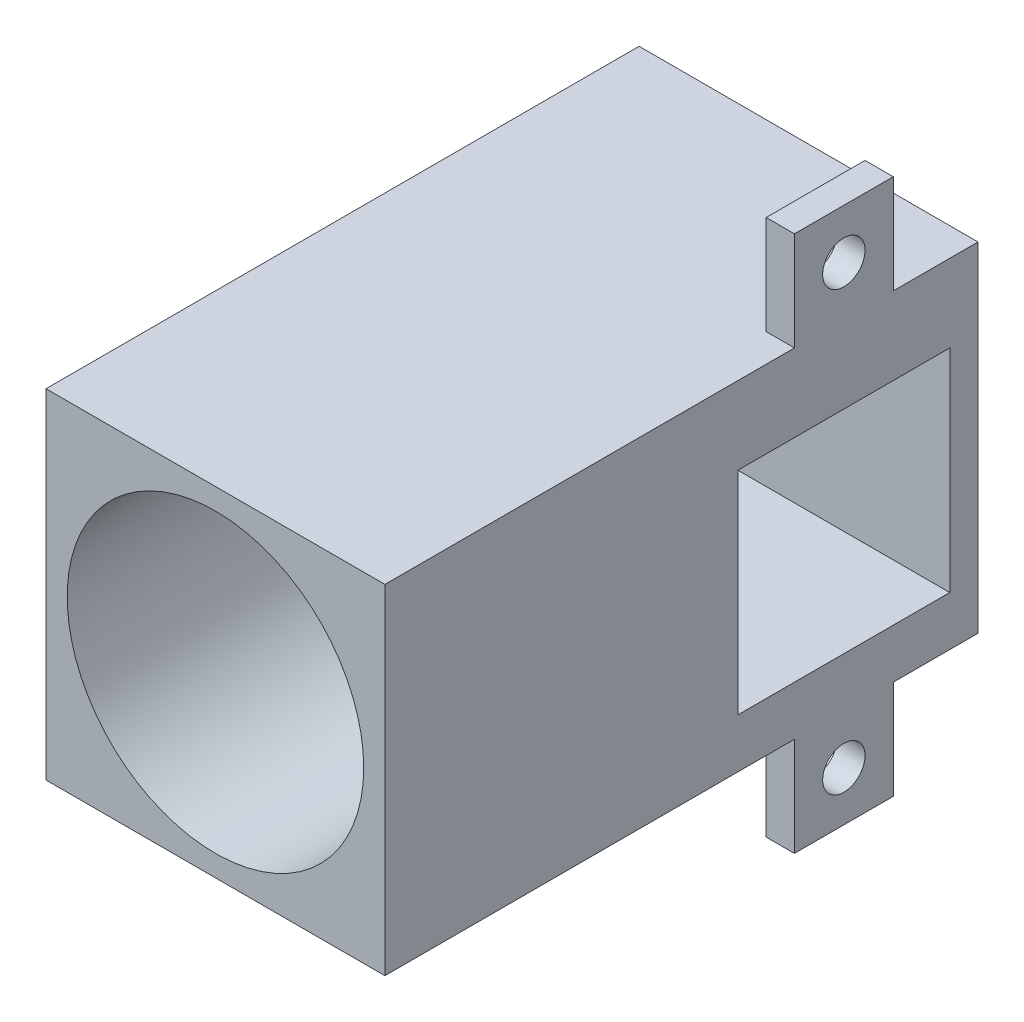
ISO-10303-21;
HEADER;
FILE_DESCRIPTION(('STEP AP214'),'2;1');
FILE_NAME('part.step','',(''),(''),'','','');
FILE_SCHEMA(('AUTOMOTIVE_DESIGN { 1 0 10303 214 1 1 1 1 }'));
ENDSEC;
DATA;
#1=APPLICATION_CONTEXT('core data for automotive mechanical design processes');
#2=APPLICATION_PROTOCOL_DEFINITION('international standard','automotive_design',2000,#1);
#3=PRODUCT_CONTEXT('',#1,'mechanical');
#4=PRODUCT('Part','Part','',(#3));
#5=PRODUCT_RELATED_PRODUCT_CATEGORY('part','',(#4));
#6=PRODUCT_DEFINITION_FORMATION('','',#4);
#7=PRODUCT_DEFINITION_CONTEXT('part definition',#1,'design');
#8=PRODUCT_DEFINITION('design','',#6,#7);
#9=PRODUCT_DEFINITION_SHAPE('','',#8);
#10=(LENGTH_UNIT() NAMED_UNIT(*) SI_UNIT(.MILLI.,.METRE.));
#11=(NAMED_UNIT(*) PLANE_ANGLE_UNIT() SI_UNIT($,.RADIAN.));
#12=(NAMED_UNIT(*) SI_UNIT($,.STERADIAN.) SOLID_ANGLE_UNIT());
#13=UNCERTAINTY_MEASURE_WITH_UNIT(LENGTH_MEASURE(1.E-05),#10,'distance_accuracy_value','');
#14=(GEOMETRIC_REPRESENTATION_CONTEXT(3) GLOBAL_UNCERTAINTY_ASSIGNED_CONTEXT((#13)) GLOBAL_UNIT_ASSIGNED_CONTEXT((#10,
#11,#12)) REPRESENTATION_CONTEXT('',''));
#15=CARTESIAN_POINT('',(0.,0.,0.));
#16=DIRECTION('',(0.,0.,1.));
#17=DIRECTION('',(1.,0.,0.));
#18=AXIS2_PLACEMENT_3D('',#15,#16,#17);
#19=CARTESIAN_POINT('',(-12.,-12.,42.));
#20=DIRECTION('',(0.,1.,0.));
#21=DIRECTION('',(0.,0.,1.));
#22=AXIS2_PLACEMENT_3D('',#19,#20,#21);
#23=PLANE('',#22);
#24=DIRECTION('',(1.,0.,0.));
#25=VECTOR('',#24,1.);
#26=CARTESIAN_POINT('',(10.,-12.,6.00000000000003));
#27=LINE('',#26,#25);
#28=CARTESIAN_POINT('',(10.,-12.,6.00000000000003));
#29=VERTEX_POINT('',#28);
#30=CARTESIAN_POINT('',(12.,-12.,6.00000000000003));
#31=VERTEX_POINT('',#30);
#32=EDGE_CURVE('E229',#29,#31,#27,.T.);
#33=ORIENTED_EDGE('',*,*,#32,.F.);
#34=DIRECTION('',(0.,0.,1.));
#35=VECTOR('',#34,1.);
#36=CARTESIAN_POINT('',(10.,-12.,6.00000000000003));
#37=LINE('',#36,#35);
#38=CARTESIAN_POINT('',(10.,-12.,13.));
#39=VERTEX_POINT('',#38);
#40=EDGE_CURVE('E215',#29,#39,#37,.T.);
#41=ORIENTED_EDGE('',*,*,#40,.T.);
#42=DIRECTION('',(1.,0.,0.));
#43=VECTOR('',#42,1.);
#44=CARTESIAN_POINT('',(10.,-12.,13.));
#45=LINE('',#44,#43);
#46=CARTESIAN_POINT('',(12.,-12.,13.));
#47=VERTEX_POINT('',#46);
#48=EDGE_CURVE('E237',#39,#47,#45,.T.);
#49=ORIENTED_EDGE('',*,*,#48,.T.);
#50=DIRECTION('',(0.,0.,-1.));
#51=VECTOR('',#50,1.);
#52=CARTESIAN_POINT('',(12.,-12.,42.));
#53=LINE('',#52,#51);
#54=CARTESIAN_POINT('',(12.,-12.,42.));
#55=VERTEX_POINT('',#54);
#56=EDGE_CURVE('E391',#55,#47,#53,.T.);
#57=ORIENTED_EDGE('',*,*,#56,.F.);
#58=DIRECTION('',(1.,0.,0.));
#59=VECTOR('',#58,1.);
#60=CARTESIAN_POINT('',(-12.,-12.,42.));
#61=LINE('',#60,#59);
#62=CARTESIAN_POINT('',(-12.,-12.,42.));
#63=VERTEX_POINT('',#62);
#64=EDGE_CURVE('E370',#63,#55,#61,.T.);
#65=ORIENTED_EDGE('',*,*,#64,.F.);
#66=DIRECTION('',(0.,0.,-1.));
#67=VECTOR('',#66,1.);
#68=CARTESIAN_POINT('',(-12.,-12.,42.));
#69=LINE('',#68,#67);
#70=CARTESIAN_POINT('',(-12.,-12.,0.));
#71=VERTEX_POINT('',#70);
#72=EDGE_CURVE('E41',#63,#71,#69,.T.);
#73=ORIENTED_EDGE('',*,*,#72,.T.);
#74=DIRECTION('',(1.,0.,0.));
#75=VECTOR('',#74,1.);
#76=CARTESIAN_POINT('',(-12.,-12.,0.));
#77=LINE('',#76,#75);
#78=CARTESIAN_POINT('',(12.,-12.,0.));
#79=VERTEX_POINT('',#78);
#80=EDGE_CURVE('E380',#71,#79,#77,.T.);
#81=ORIENTED_EDGE('',*,*,#80,.T.);
#82=EDGE_CURVE('E236',#31,#79,#53,.T.);
#83=ORIENTED_EDGE('',*,*,#82,.F.);
#84=EDGE_LOOP('',(#33,#41,#49,#57,#65,#73,#81,#83));
#85=FACE_BOUND('',#84,.T.);
#86=ADVANCED_FACE('F37',(#85),#23,.F.);
#87=CARTESIAN_POINT('',(12.,12.,42.));
#88=DIRECTION('',(0.,-1.,0.));
#89=DIRECTION('',(1.,0.,0.));
#90=AXIS2_PLACEMENT_3D('',#87,#88,#89);
#91=PLANE('',#90);
#92=DIRECTION('',(1.,0.,0.));
#93=VECTOR('',#92,1.);
#94=CARTESIAN_POINT('',(10.,12.,13.));
#95=LINE('',#94,#93);
#96=CARTESIAN_POINT('',(10.,12.,13.));
#97=VERTEX_POINT('',#96);
#98=CARTESIAN_POINT('',(12.,12.,13.));
#99=VERTEX_POINT('',#98);
#100=EDGE_CURVE('E276',#97,#99,#95,.T.);
#101=ORIENTED_EDGE('',*,*,#100,.F.);
#102=DIRECTION('',(0.,0.,-1.));
#103=VECTOR('',#102,1.);
#104=CARTESIAN_POINT('',(10.,12.,6.00000000000003));
#105=LINE('',#104,#103);
#106=CARTESIAN_POINT('',(10.,12.,6.00000000000003));
#107=VERTEX_POINT('',#106);
#108=EDGE_CURVE('E258',#97,#107,#105,.T.);
#109=ORIENTED_EDGE('',*,*,#108,.T.);
#110=DIRECTION('',(1.,0.,0.));
#111=VECTOR('',#110,1.);
#112=CARTESIAN_POINT('',(10.,12.,6.00000000000003));
#113=LINE('',#112,#111);
#114=CARTESIAN_POINT('',(12.,12.,6.00000000000004));
#115=VERTEX_POINT('',#114);
#116=EDGE_CURVE('E274',#107,#115,#113,.T.);
#117=ORIENTED_EDGE('',*,*,#116,.T.);
#118=DIRECTION('',(0.,0.,-1.));
#119=VECTOR('',#118,1.);
#120=CARTESIAN_POINT('',(12.,12.,42.));
#121=LINE('',#120,#119);
#122=CARTESIAN_POINT('',(12.,12.,0.));
#123=VERTEX_POINT('',#122);
#124=EDGE_CURVE('E388',#115,#123,#121,.T.);
#125=ORIENTED_EDGE('',*,*,#124,.T.);
#126=DIRECTION('',(-1.,0.,0.));
#127=VECTOR('',#126,1.);
#128=CARTESIAN_POINT('',(12.,12.,0.));
#129=LINE('',#128,#127);
#130=CARTESIAN_POINT('',(-12.,12.,0.));
#131=VERTEX_POINT('',#130);
#132=EDGE_CURVE('E371',#123,#131,#129,.T.);
#133=ORIENTED_EDGE('',*,*,#132,.T.);
#134=DIRECTION('',(0.,0.,-1.));
#135=VECTOR('',#134,1.);
#136=CARTESIAN_POINT('',(-12.,12.,42.));
#137=LINE('',#136,#135);
#138=CARTESIAN_POINT('',(-12.,12.,42.));
#139=VERTEX_POINT('',#138);
#140=EDGE_CURVE('E377',#139,#131,#137,.T.);
#141=ORIENTED_EDGE('',*,*,#140,.F.);
#142=DIRECTION('',(-1.,0.,0.));
#143=VECTOR('',#142,1.);
#144=CARTESIAN_POINT('',(12.,12.,42.));
#145=LINE('',#144,#143);
#146=CARTESIAN_POINT('',(12.,12.,42.));
#147=VERTEX_POINT('',#146);
#148=EDGE_CURVE('E375',#147,#139,#145,.T.);
#149=ORIENTED_EDGE('',*,*,#148,.F.);
#150=EDGE_CURVE('E389',#147,#99,#121,.T.);
#151=ORIENTED_EDGE('',*,*,#150,.T.);
#152=EDGE_LOOP('',(#101,#109,#117,#125,#133,#141,#149,#151));
#153=FACE_BOUND('',#152,.T.);
#154=ADVANCED_FACE('F411',(#153),#91,.F.);
#155=CARTESIAN_POINT('',(0.,0.,22.));
#156=DIRECTION('',(0.,0.,1.));
#157=DIRECTION('',(1.,0.,0.));
#158=AXIS2_PLACEMENT_3D('',#155,#156,#157);
#159=PLANE('',#158);
#160=DIRECTION('',(0.,-1.,0.));
#161=VECTOR('',#160,1.);
#162=CARTESIAN_POINT('',(-8.5,8.5,22.));
#163=LINE('',#162,#161);
#164=CARTESIAN_POINT('',(-8.5,6.16441400296898,22.));
#165=VERTEX_POINT('',#164);
#166=CARTESIAN_POINT('',(-8.5,-6.16441400296898,22.));
#167=VERTEX_POINT('',#166);
#168=EDGE_CURVE('E11',#165,#167,#163,.T.);
#169=ORIENTED_EDGE('',*,*,#168,.F.);
#170=CARTESIAN_POINT('',(0.,0.,22.));
#171=DIRECTION('',(0.,0.,1.));
#172=DIRECTION('',(1.,0.,0.));
#173=AXIS2_PLACEMENT_3D('',#170,#171,#172);
#174=CIRCLE('',#173,10.5);
#175=EDGE_CURVE('E530',#165,#167,#174,.T.);
#176=ORIENTED_EDGE('',*,*,#175,.T.);
#177=EDGE_LOOP('',(#169,#176));
#178=FACE_BOUND('',#177,.T.);
#179=ADVANCED_FACE('F444',(#178),#159,.T.);
#180=DIRECTION('',(1.,0.,0.));
#181=VECTOR('',#180,1.);
#182=CARTESIAN_POINT('',(8.5,-8.5,22.));
#183=LINE('',#182,#181);
#184=CARTESIAN_POINT('',(-6.16441400296898,-8.5,22.));
#185=VERTEX_POINT('',#184);
#186=CARTESIAN_POINT('',(6.16441400296898,-8.5,22.));
#187=VERTEX_POINT('',#186);
#188=EDGE_CURVE('E46',#185,#187,#183,.T.);
#189=ORIENTED_EDGE('',*,*,#188,.F.);
#190=EDGE_CURVE('E521',#185,#187,#174,.T.);
#191=ORIENTED_EDGE('',*,*,#190,.T.);
#192=EDGE_LOOP('',(#189,#191));
#193=FACE_BOUND('',#192,.T.);
#194=ADVANCED_FACE('F520',(#193),#159,.T.);
#195=DIRECTION('',(0.,1.,0.));
#196=VECTOR('',#195,1.);
#197=CARTESIAN_POINT('',(8.5,8.5,22.));
#198=LINE('',#197,#196);
#199=CARTESIAN_POINT('',(8.5,-6.16441400296898,22.));
#200=VERTEX_POINT('',#199);
#201=CARTESIAN_POINT('',(8.5,6.16441400296898,22.));
#202=VERTEX_POINT('',#201);
#203=EDGE_CURVE('E346',#200,#202,#198,.T.);
#204=ORIENTED_EDGE('',*,*,#203,.F.);
#205=EDGE_CURVE('E364',#200,#202,#174,.T.);
#206=ORIENTED_EDGE('',*,*,#205,.T.);
#207=EDGE_LOOP('',(#204,#206));
#208=FACE_BOUND('',#207,.T.);
#209=ADVANCED_FACE('F464',(#208),#159,.T.);
#210=CARTESIAN_POINT('',(-12.,12.,42.));
#211=DIRECTION('',(1.,0.,0.));
#212=DIRECTION('',(0.,0.,-1.));
#213=AXIS2_PLACEMENT_3D('',#210,#211,#212);
#214=PLANE('',#213);
#215=DIRECTION('',(0.,0.,-1.));
#216=VECTOR('',#215,1.);
#217=CARTESIAN_POINT('',(-12.,-8.5,2.));
#218=LINE('',#217,#216);
#219=CARTESIAN_POINT('',(-12.,-8.5,17.));
#220=VERTEX_POINT('',#219);
#221=CARTESIAN_POINT('',(-12.,-8.5,2.));
#222=VERTEX_POINT('',#221);
#223=EDGE_CURVE('E289',#220,#222,#218,.T.);
#224=ORIENTED_EDGE('',*,*,#223,.T.);
#225=DIRECTION('',(0.,1.,0.));
#226=VECTOR('',#225,1.);
#227=CARTESIAN_POINT('',(-12.,6.5,2.));
#228=LINE('',#227,#226);
#229=CARTESIAN_POINT('',(-12.,6.5,2.));
#230=VERTEX_POINT('',#229);
#231=EDGE_CURVE('E279',#222,#230,#228,.T.);
#232=ORIENTED_EDGE('',*,*,#231,.T.);
#233=DIRECTION('',(0.,0.,1.));
#234=VECTOR('',#233,1.);
#235=CARTESIAN_POINT('',(-12.,6.5,17.));
#236=LINE('',#235,#234);
#237=CARTESIAN_POINT('',(-12.,6.5,17.));
#238=VERTEX_POINT('',#237);
#239=EDGE_CURVE('E282',#230,#238,#236,.T.);
#240=ORIENTED_EDGE('',*,*,#239,.T.);
#241=DIRECTION('',(0.,-1.,0.));
#242=VECTOR('',#241,1.);
#243=CARTESIAN_POINT('',(-12.,-8.5,17.));
#244=LINE('',#243,#242);
#245=EDGE_CURVE('E286',#238,#220,#244,.T.);
#246=ORIENTED_EDGE('',*,*,#245,.T.);
#247=EDGE_LOOP('',(#224,#232,#240,#246));
#248=FACE_BOUND('',#247,.T.);
#249=DIRECTION('',(0.,-1.,0.));
#250=VECTOR('',#249,1.);
#251=CARTESIAN_POINT('',(-12.,12.,0.));
#252=LINE('',#251,#250);
#253=EDGE_CURVE('E362',#131,#71,#252,.T.);
#254=ORIENTED_EDGE('',*,*,#253,.T.);
#255=ORIENTED_EDGE('',*,*,#72,.F.);
#256=DIRECTION('',(0.,-1.,0.));
#257=VECTOR('',#256,1.);
#258=CARTESIAN_POINT('',(-12.,12.,42.));
#259=LINE('',#258,#257);
#260=EDGE_CURVE('E367',#139,#63,#259,.T.);
#261=ORIENTED_EDGE('',*,*,#260,.F.);
#262=ORIENTED_EDGE('',*,*,#140,.T.);
#263=EDGE_LOOP('',(#254,#255,#261,#262));
#264=FACE_BOUND('',#263,.T.);
#265=ADVANCED_FACE('F39',(#248,#264),#214,.F.);
#266=CARTESIAN_POINT('',(12.,-12.,42.));
#267=DIRECTION('',(-1.,0.,0.));
#268=DIRECTION('',(0.,0.,1.));
#269=AXIS2_PLACEMENT_3D('',#266,#267,#268);
#270=PLANE('',#269);
#271=DIRECTION('',(0.,0.,1.));
#272=VECTOR('',#271,1.);
#273=CARTESIAN_POINT('',(12.,6.5,17.));
#274=LINE('',#273,#272);
#275=CARTESIAN_POINT('',(12.,6.5,2.));
#276=VERTEX_POINT('',#275);
#277=CARTESIAN_POINT('',(12.,6.5,17.));
#278=VERTEX_POINT('',#277);
#279=EDGE_CURVE('E294',#276,#278,#274,.T.);
#280=ORIENTED_EDGE('',*,*,#279,.F.);
#281=DIRECTION('',(0.,1.,0.));
#282=VECTOR('',#281,1.);
#283=CARTESIAN_POINT('',(12.,6.5,2.));
#284=LINE('',#283,#282);
#285=CARTESIAN_POINT('',(12.,-8.5,2.));
#286=VERTEX_POINT('',#285);
#287=EDGE_CURVE('E273',#286,#276,#284,.T.);
#288=ORIENTED_EDGE('',*,*,#287,.F.);
#289=DIRECTION('',(0.,0.,-1.));
#290=VECTOR('',#289,1.);
#291=CARTESIAN_POINT('',(12.,-8.5,2.));
#292=LINE('',#291,#290);
#293=CARTESIAN_POINT('',(12.,-8.5,17.));
#294=VERTEX_POINT('',#293);
#295=EDGE_CURVE('E283',#294,#286,#292,.T.);
#296=ORIENTED_EDGE('',*,*,#295,.F.);
#297=DIRECTION('',(0.,-1.,0.));
#298=VECTOR('',#297,1.);
#299=CARTESIAN_POINT('',(12.,-8.5,17.));
#300=LINE('',#299,#298);
#301=EDGE_CURVE('E297',#278,#294,#300,.T.);
#302=ORIENTED_EDGE('',*,*,#301,.F.);
#303=EDGE_LOOP('',(#280,#288,#296,#302));
#304=FACE_BOUND('',#303,.T.);
#305=DIRECTION('',(0.,1.,0.));
#306=VECTOR('',#305,1.);
#307=CARTESIAN_POINT('',(12.,-12.,0.));
#308=LINE('',#307,#306);
#309=EDGE_CURVE('E382',#79,#123,#308,.T.);
#310=ORIENTED_EDGE('',*,*,#309,.T.);
#311=ORIENTED_EDGE('',*,*,#124,.F.);
#312=DIRECTION('',(0.,1.,0.));
#313=VECTOR('',#312,1.);
#314=CARTESIAN_POINT('',(12.,12.,6.00000000000003));
#315=LINE('',#314,#313);
#316=CARTESIAN_POINT('',(12.,19.,6.00000000000003));
#317=VERTEX_POINT('',#316);
#318=EDGE_CURVE('E64',#115,#317,#315,.T.);
#319=ORIENTED_EDGE('',*,*,#318,.T.);
#320=DIRECTION('',(0.,0.,1.));
#321=VECTOR('',#320,1.);
#322=CARTESIAN_POINT('',(12.,19.,6.00000000000003));
#323=LINE('',#322,#321);
#324=CARTESIAN_POINT('',(12.,19.,13.));
#325=VERTEX_POINT('',#324);
#326=EDGE_CURVE('E248',#317,#325,#323,.T.);
#327=ORIENTED_EDGE('',*,*,#326,.T.);
#328=DIRECTION('',(0.,-1.,0.));
#329=VECTOR('',#328,1.);
#330=CARTESIAN_POINT('',(12.,19.,13.));
#331=LINE('',#330,#329);
#332=EDGE_CURVE('E267',#325,#99,#331,.T.);
#333=ORIENTED_EDGE('',*,*,#332,.T.);
#334=ORIENTED_EDGE('',*,*,#150,.F.);
#335=DIRECTION('',(0.,1.,0.));
#336=VECTOR('',#335,1.);
#337=CARTESIAN_POINT('',(12.,-12.,42.));
#338=LINE('',#337,#336);
#339=EDGE_CURVE('E373',#55,#147,#338,.T.);
#340=ORIENTED_EDGE('',*,*,#339,.F.);
#341=ORIENTED_EDGE('',*,*,#56,.T.);
#342=DIRECTION('',(0.,-1.,0.));
#343=VECTOR('',#342,1.);
#344=CARTESIAN_POINT('',(12.,-12.,13.));
#345=LINE('',#344,#343);
#346=CARTESIAN_POINT('',(12.,-19.,13.));
#347=VERTEX_POINT('',#346);
#348=EDGE_CURVE('E56',#47,#347,#345,.T.);
#349=ORIENTED_EDGE('',*,*,#348,.T.);
#350=DIRECTION('',(0.,0.,-1.));
#351=VECTOR('',#350,1.);
#352=CARTESIAN_POINT('',(12.,-19.,13.));
#353=LINE('',#352,#351);
#354=CARTESIAN_POINT('',(12.,-19.,6.00000000000003));
#355=VERTEX_POINT('',#354);
#356=EDGE_CURVE('E232',#347,#355,#353,.T.);
#357=ORIENTED_EDGE('',*,*,#356,.T.);
#358=DIRECTION('',(0.,1.,0.));
#359=VECTOR('',#358,1.);
#360=CARTESIAN_POINT('',(12.,-19.,6.00000000000003));
#361=LINE('',#360,#359);
#362=EDGE_CURVE('E403',#355,#31,#361,.T.);
#363=ORIENTED_EDGE('',*,*,#362,.T.);
#364=ORIENTED_EDGE('',*,*,#82,.T.);
#365=EDGE_LOOP('',(#310,#311,#319,#327,#333,#334,#340,#341,#349,#357,#363,#364));
#366=FACE_BOUND('',#365,.T.);
#367=CARTESIAN_POINT('',(12.,15.5,9.50000000000002));
#368=DIRECTION('',(1.,0.,0.));
#369=DIRECTION('',(0.,0.,-1.));
#370=AXIS2_PLACEMENT_3D('',#367,#368,#369);
#371=CIRCLE('',#370,1.5);
#372=CARTESIAN_POINT('',(12.,15.5,8.00000000000002));
#373=VERTEX_POINT('',#372);
#374=EDGE_CURVE('E249',#373,#373,#371,.T.);
#375=ORIENTED_EDGE('',*,*,#374,.F.);
#376=EDGE_LOOP('',(#375));
#377=FACE_BOUND('',#376,.T.);
#378=CARTESIAN_POINT('',(12.,-15.5,9.50000000000002));
#379=DIRECTION('',(1.,0.,0.));
#380=DIRECTION('',(0.,0.,-1.));
#381=AXIS2_PLACEMENT_3D('',#378,#379,#380);
#382=CIRCLE('',#381,1.5);
#383=CARTESIAN_POINT('',(12.,-15.5,8.00000000000002));
#384=VERTEX_POINT('',#383);
#385=EDGE_CURVE('E748',#384,#384,#382,.T.);
#386=ORIENTED_EDGE('',*,*,#385,.F.);
#387=EDGE_LOOP('',(#386));
#388=FACE_BOUND('',#387,.T.);
#389=ADVANCED_FACE('F397',(#304,#366,#377,#388),#270,.F.);
#390=CARTESIAN_POINT('',(0.,0.,42.));
#391=DIRECTION('',(0.,0.,1.));
#392=DIRECTION('',(1.,0.,0.));
#393=AXIS2_PLACEMENT_3D('',#390,#391,#392);
#394=PLANE('',#393);
#395=CARTESIAN_POINT('',(0.,0.,42.));
#396=DIRECTION('',(0.,0.,1.));
#397=DIRECTION('',(1.,0.,0.));
#398=AXIS2_PLACEMENT_3D('',#395,#396,#397);
#399=CIRCLE('',#398,10.5);
#400=CARTESIAN_POINT('',(10.5,0.,42.));
#401=VERTEX_POINT('',#400);
#402=EDGE_CURVE('E352',#401,#401,#399,.T.);
#403=ORIENTED_EDGE('',*,*,#402,.F.);
#404=EDGE_LOOP('',(#403));
#405=FACE_BOUND('',#404,.T.);
#406=ORIENTED_EDGE('',*,*,#260,.T.);
#407=ORIENTED_EDGE('',*,*,#64,.T.);
#408=ORIENTED_EDGE('',*,*,#339,.T.);
#409=ORIENTED_EDGE('',*,*,#148,.T.);
#410=EDGE_LOOP('',(#406,#407,#408,#409));
#411=FACE_BOUND('',#410,.T.);
#412=ADVANCED_FACE('F416',(#405,#411),#394,.T.);
#413=CARTESIAN_POINT('',(0.,0.,0.));
#414=DIRECTION('',(0.,0.,1.));
#415=DIRECTION('',(1.,0.,0.));
#416=AXIS2_PLACEMENT_3D('',#413,#414,#415);
#417=PLANE('',#416);
#418=ORIENTED_EDGE('',*,*,#253,.F.);
#419=ORIENTED_EDGE('',*,*,#132,.F.);
#420=ORIENTED_EDGE('',*,*,#309,.F.);
#421=ORIENTED_EDGE('',*,*,#80,.F.);
#422=EDGE_LOOP('',(#418,#419,#420,#421));
#423=FACE_BOUND('',#422,.T.);
#424=ADVANCED_FACE('F407',(#423),#417,.F.);
#425=CARTESIAN_POINT('',(0.,0.,22.));
#426=DIRECTION('',(0.,0.,1.));
#427=DIRECTION('',(1.,0.,0.));
#428=AXIS2_PLACEMENT_3D('',#425,#426,#427);
#429=CYLINDRICAL_SURFACE('',#428,10.5);
#430=CARTESIAN_POINT('',(6.16441400296898,8.5,22.));
#431=VERTEX_POINT('',#430);
#432=EDGE_CURVE('E359',#202,#431,#174,.T.);
#433=ORIENTED_EDGE('',*,*,#432,.F.);
#434=ORIENTED_EDGE('',*,*,#205,.F.);
#435=EDGE_CURVE('E529',#187,#200,#174,.T.);
#436=ORIENTED_EDGE('',*,*,#435,.F.);
#437=ORIENTED_EDGE('',*,*,#190,.F.);
#438=EDGE_CURVE('E526',#167,#185,#174,.T.);
#439=ORIENTED_EDGE('',*,*,#438,.F.);
#440=ORIENTED_EDGE('',*,*,#175,.F.);
#441=CARTESIAN_POINT('',(-6.16441400296898,8.5,22.));
#442=VERTEX_POINT('',#441);
#443=EDGE_CURVE('E547',#442,#165,#174,.T.);
#444=ORIENTED_EDGE('',*,*,#443,.F.);
#445=EDGE_CURVE('E363',#431,#442,#174,.T.);
#446=ORIENTED_EDGE('',*,*,#445,.F.);
#447=EDGE_LOOP('',(#433,#434,#436,#437,#439,#440,#444,#446));
#448=FACE_BOUND('',#447,.T.);
#449=ORIENTED_EDGE('',*,*,#402,.T.);
#450=EDGE_LOOP('',(#449));
#451=FACE_BOUND('',#450,.T.);
#452=ADVANCED_FACE('F452',(#448,#451),#429,.F.);
#453=DIRECTION('',(-1.,0.,0.));
#454=VECTOR('',#453,1.);
#455=CARTESIAN_POINT('',(8.5,8.5,22.));
#456=LINE('',#455,#454);
#457=EDGE_CURVE('E348',#431,#442,#456,.T.);
#458=ORIENTED_EDGE('',*,*,#457,.F.);
#459=ORIENTED_EDGE('',*,*,#445,.T.);
#460=EDGE_LOOP('',(#458,#459));
#461=FACE_BOUND('',#460,.T.);
#462=ADVANCED_FACE('F458',(#461),#159,.T.);
#463=CARTESIAN_POINT('',(0.,0.,22.));
#464=DIRECTION('',(0.,0.,-1.));
#465=DIRECTION('',(-1.,0.,0.));
#466=AXIS2_PLACEMENT_3D('',#463,#464,#465);
#467=PLANE('',#466);
#468=ORIENTED_EDGE('',*,*,#432,.T.);
#469=CARTESIAN_POINT('',(8.5,8.5,22.));
#470=VERTEX_POINT('',#469);
#471=EDGE_CURVE('E328',#470,#431,#456,.T.);
#472=ORIENTED_EDGE('',*,*,#471,.F.);
#473=EDGE_CURVE('E341',#202,#470,#198,.T.);
#474=ORIENTED_EDGE('',*,*,#473,.F.);
#475=EDGE_LOOP('',(#468,#472,#474));
#476=FACE_BOUND('',#475,.T.);
#477=ADVANCED_FACE('F462',(#476),#467,.T.);
#478=ORIENTED_EDGE('',*,*,#443,.T.);
#479=CARTESIAN_POINT('',(-8.5,8.5,22.));
#480=VERTEX_POINT('',#479);
#481=EDGE_CURVE('E48',#480,#165,#163,.T.);
#482=ORIENTED_EDGE('',*,*,#481,.F.);
#483=EDGE_CURVE('E345',#442,#480,#456,.T.);
#484=ORIENTED_EDGE('',*,*,#483,.F.);
#485=EDGE_LOOP('',(#478,#482,#484));
#486=FACE_BOUND('',#485,.T.);
#487=ADVANCED_FACE('F485',(#486),#467,.T.);
#488=ORIENTED_EDGE('',*,*,#438,.T.);
#489=CARTESIAN_POINT('',(-8.5,-8.5,22.));
#490=VERTEX_POINT('',#489);
#491=EDGE_CURVE('E338',#490,#185,#183,.T.);
#492=ORIENTED_EDGE('',*,*,#491,.F.);
#493=EDGE_CURVE('E49',#167,#490,#163,.T.);
#494=ORIENTED_EDGE('',*,*,#493,.F.);
#495=EDGE_LOOP('',(#488,#492,#494));
#496=FACE_BOUND('',#495,.T.);
#497=ADVANCED_FACE('F595',(#496),#467,.T.);
#498=ORIENTED_EDGE('',*,*,#435,.T.);
#499=CARTESIAN_POINT('',(8.5,-8.5,22.));
#500=VERTEX_POINT('',#499);
#501=EDGE_CURVE('E342',#500,#200,#198,.T.);
#502=ORIENTED_EDGE('',*,*,#501,.F.);
#503=EDGE_CURVE('E337',#187,#500,#183,.T.);
#504=ORIENTED_EDGE('',*,*,#503,.F.);
#505=EDGE_LOOP('',(#498,#502,#504));
#506=FACE_BOUND('',#505,.T.);
#507=ADVANCED_FACE('F469',(#506),#467,.T.);
#508=CARTESIAN_POINT('',(-8.5,8.5,2.));
#509=DIRECTION('',(-1.,0.,0.));
#510=DIRECTION('',(0.,0.,1.));
#511=AXIS2_PLACEMENT_3D('',#508,#509,#510);
#512=PLANE('',#511);
#513=DIRECTION('',(0.,0.,1.));
#514=VECTOR('',#513,1.);
#515=CARTESIAN_POINT('',(-8.5,-8.5,2.));
#516=LINE('',#515,#514);
#517=CARTESIAN_POINT('',(-8.5,-8.5,17.));
#518=VERTEX_POINT('',#517);
#519=EDGE_CURVE('E334',#518,#490,#516,.T.);
#520=ORIENTED_EDGE('',*,*,#519,.F.);
#521=DIRECTION('',(0.,1.,0.));
#522=VECTOR('',#521,1.);
#523=CARTESIAN_POINT('',(-8.5,8.5,17.));
#524=LINE('',#523,#522);
#525=CARTESIAN_POINT('',(-8.5,6.5,17.));
#526=VERTEX_POINT('',#525);
#527=EDGE_CURVE('E321',#518,#526,#524,.T.);
#528=ORIENTED_EDGE('',*,*,#527,.T.);
#529=DIRECTION('',(0.,0.,-1.));
#530=VECTOR('',#529,1.);
#531=CARTESIAN_POINT('',(-8.5,6.5,2.));
#532=LINE('',#531,#530);
#533=CARTESIAN_POINT('',(-8.5,6.5,2.));
#534=VERTEX_POINT('',#533);
#535=EDGE_CURVE('E315',#526,#534,#532,.T.);
#536=ORIENTED_EDGE('',*,*,#535,.T.);
#537=DIRECTION('',(0.,-1.,0.));
#538=VECTOR('',#537,1.);
#539=CARTESIAN_POINT('',(-8.5,8.5,2.));
#540=LINE('',#539,#538);
#541=CARTESIAN_POINT('',(-8.5,8.5,2.));
#542=VERTEX_POINT('',#541);
#543=EDGE_CURVE('E324',#542,#534,#540,.T.);
#544=ORIENTED_EDGE('',*,*,#543,.F.);
#545=DIRECTION('',(0.,0.,1.));
#546=VECTOR('',#545,1.);
#547=CARTESIAN_POINT('',(-8.5,8.5,2.));
#548=LINE('',#547,#546);
#549=EDGE_CURVE('E349',#542,#480,#548,.T.);
#550=ORIENTED_EDGE('',*,*,#549,.T.);
#551=ORIENTED_EDGE('',*,*,#481,.T.);
#552=ORIENTED_EDGE('',*,*,#168,.T.);
#553=ORIENTED_EDGE('',*,*,#493,.T.);
#554=EDGE_LOOP('',(#520,#528,#536,#544,#550,#551,#552,#553));
#555=FACE_BOUND('',#554,.T.);
#556=ADVANCED_FACE('F465',(#555),#512,.F.);
#557=CARTESIAN_POINT('',(8.5,8.5,2.));
#558=DIRECTION('',(0.,1.,0.));
#559=DIRECTION('',(-1.,0.,0.));
#560=AXIS2_PLACEMENT_3D('',#557,#558,#559);
#561=PLANE('',#560);
#562=ORIENTED_EDGE('',*,*,#471,.T.);
#563=ORIENTED_EDGE('',*,*,#457,.T.);
#564=ORIENTED_EDGE('',*,*,#483,.T.);
#565=ORIENTED_EDGE('',*,*,#549,.F.);
#566=DIRECTION('',(-1.,0.,0.));
#567=VECTOR('',#566,1.);
#568=CARTESIAN_POINT('',(8.5,8.5,2.));
#569=LINE('',#568,#567);
#570=CARTESIAN_POINT('',(8.5,8.5,2.));
#571=VERTEX_POINT('',#570);
#572=EDGE_CURVE('E332',#571,#542,#569,.T.);
#573=ORIENTED_EDGE('',*,*,#572,.F.);
#574=DIRECTION('',(0.,0.,1.));
#575=VECTOR('',#574,1.);
#576=CARTESIAN_POINT('',(8.5,8.5,2.));
#577=LINE('',#576,#575);
#578=EDGE_CURVE('E353',#571,#470,#577,.T.);
#579=ORIENTED_EDGE('',*,*,#578,.T.);
#580=EDGE_LOOP('',(#562,#563,#564,#565,#573,#579));
#581=FACE_BOUND('',#580,.T.);
#582=ADVANCED_FACE('F468',(#581),#561,.F.);
#583=CARTESIAN_POINT('',(8.5,8.5,2.));
#584=DIRECTION('',(1.,0.,0.));
#585=DIRECTION('',(0.,1.,0.));
#586=AXIS2_PLACEMENT_3D('',#583,#584,#585);
#587=PLANE('',#586);
#588=DIRECTION('',(0.,0.,1.));
#589=VECTOR('',#588,1.);
#590=CARTESIAN_POINT('',(8.5,6.5,2.));
#591=LINE('',#590,#589);
#592=CARTESIAN_POINT('',(8.5,6.5,2.));
#593=VERTEX_POINT('',#592);
#594=CARTESIAN_POINT('',(8.5,6.5,17.));
#595=VERTEX_POINT('',#594);
#596=EDGE_CURVE('E305',#593,#595,#591,.T.);
#597=ORIENTED_EDGE('',*,*,#596,.T.);
#598=DIRECTION('',(0.,-1.,0.));
#599=VECTOR('',#598,1.);
#600=CARTESIAN_POINT('',(8.5,8.5,17.));
#601=LINE('',#600,#599);
#602=CARTESIAN_POINT('',(8.5,-8.5,17.));
#603=VERTEX_POINT('',#602);
#604=EDGE_CURVE('E318',#595,#603,#601,.T.);
#605=ORIENTED_EDGE('',*,*,#604,.T.);
#606=DIRECTION('',(0.,0.,1.));
#607=VECTOR('',#606,1.);
#608=CARTESIAN_POINT('',(8.5,-8.5,2.));
#609=LINE('',#608,#607);
#610=EDGE_CURVE('E356',#603,#500,#609,.T.);
#611=ORIENTED_EDGE('',*,*,#610,.T.);
#612=ORIENTED_EDGE('',*,*,#501,.T.);
#613=ORIENTED_EDGE('',*,*,#203,.T.);
#614=ORIENTED_EDGE('',*,*,#473,.T.);
#615=ORIENTED_EDGE('',*,*,#578,.F.);
#616=DIRECTION('',(0.,1.,0.));
#617=VECTOR('',#616,1.);
#618=CARTESIAN_POINT('',(8.5,8.5,2.));
#619=LINE('',#618,#617);
#620=EDGE_CURVE('E330',#593,#571,#619,.T.);
#621=ORIENTED_EDGE('',*,*,#620,.F.);
#622=EDGE_LOOP('',(#597,#605,#611,#612,#613,#614,#615,#621));
#623=FACE_BOUND('',#622,.T.);
#624=ADVANCED_FACE('F475',(#623),#587,.F.);
#625=CARTESIAN_POINT('',(8.5,-8.5,2.));
#626=DIRECTION('',(0.,-1.,0.));
#627=DIRECTION('',(1.,0.,0.));
#628=AXIS2_PLACEMENT_3D('',#625,#626,#627);
#629=PLANE('',#628);
#630=ORIENTED_EDGE('',*,*,#610,.F.);
#631=DIRECTION('',(1.,0.,0.));
#632=VECTOR('',#631,1.);
#633=CARTESIAN_POINT('',(-12.,-8.5,17.));
#634=LINE('',#633,#632);
#635=EDGE_CURVE('E306',#603,#294,#634,.T.);
#636=ORIENTED_EDGE('',*,*,#635,.T.);
#637=ORIENTED_EDGE('',*,*,#295,.T.);
#638=DIRECTION('',(1.,0.,0.));
#639=VECTOR('',#638,1.);
#640=CARTESIAN_POINT('',(8.5,-8.5,2.));
#641=LINE('',#640,#639);
#642=EDGE_CURVE('E327',#222,#286,#641,.T.);
#643=ORIENTED_EDGE('',*,*,#642,.F.);
#644=ORIENTED_EDGE('',*,*,#223,.F.);
#645=EDGE_CURVE('E302',#220,#518,#634,.T.);
#646=ORIENTED_EDGE('',*,*,#645,.T.);
#647=ORIENTED_EDGE('',*,*,#519,.T.);
#648=ORIENTED_EDGE('',*,*,#491,.T.);
#649=ORIENTED_EDGE('',*,*,#188,.T.);
#650=ORIENTED_EDGE('',*,*,#503,.T.);
#651=EDGE_LOOP('',(#630,#636,#637,#643,#644,#646,#647,#648,#649,#650));
#652=FACE_BOUND('',#651,.T.);
#653=ADVANCED_FACE('F471',(#652),#629,.F.);
#654=CARTESIAN_POINT('',(0.,0.,2.));
#655=DIRECTION('',(0.,0.,-1.));
#656=DIRECTION('',(-1.,0.,0.));
#657=AXIS2_PLACEMENT_3D('',#654,#655,#656);
#658=PLANE('',#657);
#659=ORIENTED_EDGE('',*,*,#543,.T.);
#660=DIRECTION('',(1.,0.,0.));
#661=VECTOR('',#660,1.);
#662=CARTESIAN_POINT('',(-12.,6.5,2.));
#663=LINE('',#662,#661);
#664=EDGE_CURVE('E311',#230,#534,#663,.T.);
#665=ORIENTED_EDGE('',*,*,#664,.F.);
#666=ORIENTED_EDGE('',*,*,#231,.F.);
#667=ORIENTED_EDGE('',*,*,#642,.T.);
#668=ORIENTED_EDGE('',*,*,#287,.T.);
#669=EDGE_CURVE('E292',#593,#276,#663,.T.);
#670=ORIENTED_EDGE('',*,*,#669,.F.);
#671=ORIENTED_EDGE('',*,*,#620,.T.);
#672=ORIENTED_EDGE('',*,*,#572,.T.);
#673=EDGE_LOOP('',(#659,#665,#666,#667,#668,#670,#671,#672));
#674=FACE_BOUND('',#673,.T.);
#675=ADVANCED_FACE('F474',(#674),#658,.F.);
#676=CARTESIAN_POINT('',(-12.,6.5,17.));
#677=DIRECTION('',(0.,1.,0.));
#678=DIRECTION('',(0.,0.,1.));
#679=AXIS2_PLACEMENT_3D('',#676,#677,#678);
#680=PLANE('',#679);
#681=ORIENTED_EDGE('',*,*,#669,.T.);
#682=ORIENTED_EDGE('',*,*,#279,.T.);
#683=DIRECTION('',(1.,0.,0.));
#684=VECTOR('',#683,1.);
#685=CARTESIAN_POINT('',(-12.,6.5,17.));
#686=LINE('',#685,#684);
#687=EDGE_CURVE('E310',#595,#278,#686,.T.);
#688=ORIENTED_EDGE('',*,*,#687,.F.);
#689=ORIENTED_EDGE('',*,*,#596,.F.);
#690=EDGE_LOOP('',(#681,#682,#688,#689));
#691=FACE_BOUND('',#690,.T.);
#692=ADVANCED_FACE('F489',(#691),#680,.F.);
#693=CARTESIAN_POINT('',(-12.,-8.5,17.));
#694=DIRECTION('',(0.,0.,1.));
#695=DIRECTION('',(1.,0.,0.));
#696=AXIS2_PLACEMENT_3D('',#693,#694,#695);
#697=PLANE('',#696);
#698=ORIENTED_EDGE('',*,*,#687,.T.);
#699=ORIENTED_EDGE('',*,*,#301,.T.);
#700=ORIENTED_EDGE('',*,*,#635,.F.);
#701=ORIENTED_EDGE('',*,*,#604,.F.);
#702=EDGE_LOOP('',(#698,#699,#700,#701));
#703=FACE_BOUND('',#702,.T.);
#704=ADVANCED_FACE('F496',(#703),#697,.F.);
#705=ORIENTED_EDGE('',*,*,#645,.F.);
#706=ORIENTED_EDGE('',*,*,#245,.F.);
#707=EDGE_CURVE('E307',#238,#526,#686,.T.);
#708=ORIENTED_EDGE('',*,*,#707,.T.);
#709=ORIENTED_EDGE('',*,*,#527,.F.);
#710=EDGE_LOOP('',(#705,#706,#708,#709));
#711=FACE_BOUND('',#710,.T.);
#712=ADVANCED_FACE('F493',(#711),#697,.F.);
#713=ORIENTED_EDGE('',*,*,#707,.F.);
#714=ORIENTED_EDGE('',*,*,#239,.F.);
#715=ORIENTED_EDGE('',*,*,#664,.T.);
#716=ORIENTED_EDGE('',*,*,#535,.F.);
#717=EDGE_LOOP('',(#713,#714,#715,#716));
#718=FACE_BOUND('',#717,.T.);
#719=ADVANCED_FACE('F437',(#718),#680,.F.);
#720=CARTESIAN_POINT('',(10.,19.,6.00000000000003));
#721=DIRECTION('',(0.,1.,0.));
#722=DIRECTION('',(0.,0.,1.));
#723=AXIS2_PLACEMENT_3D('',#720,#721,#722);
#724=PLANE('',#723);
#725=ORIENTED_EDGE('',*,*,#326,.F.);
#726=DIRECTION('',(1.,0.,0.));
#727=VECTOR('',#726,1.);
#728=CARTESIAN_POINT('',(10.,19.,6.00000000000003));
#729=LINE('',#728,#727);
#730=CARTESIAN_POINT('',(10.,19.,6.00000000000003));
#731=VERTEX_POINT('',#730);
#732=EDGE_CURVE('E271',#731,#317,#729,.T.);
#733=ORIENTED_EDGE('',*,*,#732,.F.);
#734=DIRECTION('',(0.,0.,1.));
#735=VECTOR('',#734,1.);
#736=CARTESIAN_POINT('',(10.,19.,6.00000000000003));
#737=LINE('',#736,#735);
#738=CARTESIAN_POINT('',(10.,19.,13.));
#739=VERTEX_POINT('',#738);
#740=EDGE_CURVE('E252',#731,#739,#737,.T.);
#741=ORIENTED_EDGE('',*,*,#740,.T.);
#742=DIRECTION('',(1.,0.,0.));
#743=VECTOR('',#742,1.);
#744=CARTESIAN_POINT('',(10.,19.,13.));
#745=LINE('',#744,#743);
#746=EDGE_CURVE('E264',#739,#325,#745,.T.);
#747=ORIENTED_EDGE('',*,*,#746,.T.);
#748=EDGE_LOOP('',(#725,#733,#741,#747));
#749=FACE_BOUND('',#748,.T.);
#750=ADVANCED_FACE('F428',(#749),#724,.T.);
#751=CARTESIAN_POINT('',(10.,12.,6.00000000000003));
#752=DIRECTION('',(0.,0.,-1.));
#753=DIRECTION('',(-1.,0.,0.));
#754=AXIS2_PLACEMENT_3D('',#751,#752,#753);
#755=PLANE('',#754);
#756=ORIENTED_EDGE('',*,*,#318,.F.);
#757=ORIENTED_EDGE('',*,*,#116,.F.);
#758=DIRECTION('',(0.,1.,0.));
#759=VECTOR('',#758,1.);
#760=CARTESIAN_POINT('',(10.,12.,6.00000000000003));
#761=LINE('',#760,#759);
#762=EDGE_CURVE('E261',#107,#731,#761,.T.);
#763=ORIENTED_EDGE('',*,*,#762,.T.);
#764=ORIENTED_EDGE('',*,*,#732,.T.);
#765=EDGE_LOOP('',(#756,#757,#763,#764));
#766=FACE_BOUND('',#765,.T.);
#767=ADVANCED_FACE('F429',(#766),#755,.T.);
#768=CARTESIAN_POINT('',(10.,19.,13.));
#769=DIRECTION('',(0.,0.,1.));
#770=DIRECTION('',(1.,0.,0.));
#771=AXIS2_PLACEMENT_3D('',#768,#769,#770);
#772=PLANE('',#771);
#773=ORIENTED_EDGE('',*,*,#332,.F.);
#774=ORIENTED_EDGE('',*,*,#746,.F.);
#775=DIRECTION('',(0.,-1.,0.));
#776=VECTOR('',#775,1.);
#777=CARTESIAN_POINT('',(10.,19.,13.));
#778=LINE('',#777,#776);
#779=EDGE_CURVE('E255',#739,#97,#778,.T.);
#780=ORIENTED_EDGE('',*,*,#779,.T.);
#781=ORIENTED_EDGE('',*,*,#100,.T.);
#782=EDGE_LOOP('',(#773,#774,#780,#781));
#783=FACE_BOUND('',#782,.T.);
#784=ADVANCED_FACE('F421',(#783),#772,.T.);
#785=CARTESIAN_POINT('',(10.,0.,0.));
#786=DIRECTION('',(1.,0.,0.));
#787=DIRECTION('',(0.,0.,-1.));
#788=AXIS2_PLACEMENT_3D('',#785,#786,#787);
#789=PLANE('',#788);
#790=CARTESIAN_POINT('',(10.,15.5,9.50000000000002));
#791=DIRECTION('',(1.,0.,0.));
#792=DIRECTION('',(0.,0.,-1.));
#793=AXIS2_PLACEMENT_3D('',#790,#791,#792);
#794=CIRCLE('',#793,1.5);
#795=CARTESIAN_POINT('',(10.,15.5,8.00000000000002));
#796=VERTEX_POINT('',#795);
#797=EDGE_CURVE('E245',#796,#796,#794,.T.);
#798=ORIENTED_EDGE('',*,*,#797,.T.);
#799=EDGE_LOOP('',(#798));
#800=FACE_BOUND('',#799,.T.);
#801=ORIENTED_EDGE('',*,*,#740,.F.);
#802=ORIENTED_EDGE('',*,*,#762,.F.);
#803=ORIENTED_EDGE('',*,*,#108,.F.);
#804=ORIENTED_EDGE('',*,*,#779,.F.);
#805=EDGE_LOOP('',(#801,#802,#803,#804));
#806=FACE_BOUND('',#805,.T.);
#807=ADVANCED_FACE('F425',(#800,#806),#789,.F.);
#808=CARTESIAN_POINT('',(10.,15.5,9.50000000000002));
#809=DIRECTION('',(1.,0.,0.));
#810=DIRECTION('',(0.,0.,-1.));
#811=AXIS2_PLACEMENT_3D('',#808,#809,#810);
#812=CYLINDRICAL_SURFACE('',#811,1.5);
#813=ORIENTED_EDGE('',*,*,#797,.F.);
#814=EDGE_LOOP('',(#813));
#815=FACE_BOUND('',#814,.T.);
#816=ORIENTED_EDGE('',*,*,#374,.T.);
#817=EDGE_LOOP('',(#816));
#818=FACE_BOUND('',#817,.T.);
#819=ADVANCED_FACE('F683',(#815,#818),#812,.F.);
#820=CARTESIAN_POINT('',(10.,-19.,6.00000000000003));
#821=DIRECTION('',(0.,0.,-1.));
#822=DIRECTION('',(0.,1.,0.));
#823=AXIS2_PLACEMENT_3D('',#820,#821,#822);
#824=PLANE('',#823);
#825=ORIENTED_EDGE('',*,*,#362,.F.);
#826=DIRECTION('',(1.,0.,0.));
#827=VECTOR('',#826,1.);
#828=CARTESIAN_POINT('',(10.,-19.,6.00000000000003));
#829=LINE('',#828,#827);
#830=CARTESIAN_POINT('',(10.,-19.,6.00000000000003));
#831=VERTEX_POINT('',#830);
#832=EDGE_CURVE('E231',#831,#355,#829,.T.);
#833=ORIENTED_EDGE('',*,*,#832,.F.);
#834=DIRECTION('',(0.,1.,0.));
#835=VECTOR('',#834,1.);
#836=CARTESIAN_POINT('',(10.,-19.,6.00000000000003));
#837=LINE('',#836,#835);
#838=EDGE_CURVE('E219',#831,#29,#837,.T.);
#839=ORIENTED_EDGE('',*,*,#838,.T.);
#840=ORIENTED_EDGE('',*,*,#32,.T.);
#841=EDGE_LOOP('',(#825,#833,#839,#840));
#842=FACE_BOUND('',#841,.T.);
#843=ADVANCED_FACE('F228',(#842),#824,.T.);
#844=CARTESIAN_POINT('',(10.,-19.,13.));
#845=DIRECTION('',(0.,-1.,0.));
#846=DIRECTION('',(0.,0.,-1.));
#847=AXIS2_PLACEMENT_3D('',#844,#845,#846);
#848=PLANE('',#847);
#849=ORIENTED_EDGE('',*,*,#356,.F.);
#850=DIRECTION('',(1.,0.,0.));
#851=VECTOR('',#850,1.);
#852=CARTESIAN_POINT('',(10.,-19.,13.));
#853=LINE('',#852,#851);
#854=CARTESIAN_POINT('',(10.,-19.,13.));
#855=VERTEX_POINT('',#854);
#856=EDGE_CURVE('E240',#855,#347,#853,.T.);
#857=ORIENTED_EDGE('',*,*,#856,.F.);
#858=DIRECTION('',(0.,0.,-1.));
#859=VECTOR('',#858,1.);
#860=CARTESIAN_POINT('',(10.,-19.,13.));
#861=LINE('',#860,#859);
#862=EDGE_CURVE('E238',#855,#831,#861,.T.);
#863=ORIENTED_EDGE('',*,*,#862,.T.);
#864=ORIENTED_EDGE('',*,*,#832,.T.);
#865=EDGE_LOOP('',(#849,#857,#863,#864));
#866=FACE_BOUND('',#865,.T.);
#867=ADVANCED_FACE('F699',(#866),#848,.T.);
#868=CARTESIAN_POINT('',(10.,-12.,13.));
#869=DIRECTION('',(0.,0.,1.));
#870=DIRECTION('',(1.,0.,0.));
#871=AXIS2_PLACEMENT_3D('',#868,#869,#870);
#872=PLANE('',#871);
#873=ORIENTED_EDGE('',*,*,#348,.F.);
#874=ORIENTED_EDGE('',*,*,#48,.F.);
#875=DIRECTION('',(0.,-1.,0.));
#876=VECTOR('',#875,1.);
#877=CARTESIAN_POINT('',(10.,-12.,13.));
#878=LINE('',#877,#876);
#879=EDGE_CURVE('E222',#39,#855,#878,.T.);
#880=ORIENTED_EDGE('',*,*,#879,.T.);
#881=ORIENTED_EDGE('',*,*,#856,.T.);
#882=EDGE_LOOP('',(#873,#874,#880,#881));
#883=FACE_BOUND('',#882,.T.);
#884=ADVANCED_FACE('F707',(#883),#872,.T.);
#885=CARTESIAN_POINT('',(10.,0.,0.));
#886=DIRECTION('',(1.,0.,0.));
#887=DIRECTION('',(0.,0.,-1.));
#888=AXIS2_PLACEMENT_3D('',#885,#886,#887);
#889=PLANE('',#888);
#890=CARTESIAN_POINT('',(10.,-15.5,9.50000000000002));
#891=DIRECTION('',(1.,0.,0.));
#892=DIRECTION('',(0.,0.,-1.));
#893=AXIS2_PLACEMENT_3D('',#890,#891,#892);
#894=CIRCLE('',#893,1.5);
#895=CARTESIAN_POINT('',(10.,-15.5,8.00000000000002));
#896=VERTEX_POINT('',#895);
#897=EDGE_CURVE('E745',#896,#896,#894,.T.);
#898=ORIENTED_EDGE('',*,*,#897,.T.);
#899=EDGE_LOOP('',(#898));
#900=FACE_BOUND('',#899,.T.);
#901=ORIENTED_EDGE('',*,*,#838,.F.);
#902=ORIENTED_EDGE('',*,*,#862,.F.);
#903=ORIENTED_EDGE('',*,*,#879,.F.);
#904=ORIENTED_EDGE('',*,*,#40,.F.);
#905=EDGE_LOOP('',(#901,#902,#903,#904));
#906=FACE_BOUND('',#905,.T.);
#907=ADVANCED_FACE('F217',(#900,#906),#889,.F.);
#908=CARTESIAN_POINT('',(10.,-15.5,9.50000000000002));
#909=DIRECTION('',(1.,0.,0.));
#910=DIRECTION('',(0.,0.,-1.));
#911=AXIS2_PLACEMENT_3D('',#908,#909,#910);
#912=CYLINDRICAL_SURFACE('',#911,1.5);
#913=ORIENTED_EDGE('',*,*,#897,.F.);
#914=EDGE_LOOP('',(#913));
#915=FACE_BOUND('',#914,.T.);
#916=ORIENTED_EDGE('',*,*,#385,.T.);
#917=EDGE_LOOP('',(#916));
#918=FACE_BOUND('',#917,.T.);
#919=ADVANCED_FACE('F723',(#915,#918),#912,.F.);
#920=CLOSED_SHELL('',(#86,#154,#179,#194,#209,#265,#389,#412,#424,#452,#462,#477,#487,#497,#507,
#556,#582,#624,#653,#675,#692,#704,#712,#719,#750,#767,#784,#807,#819,#843,#867,#884,#907,#919));
#921=MANIFOLD_SOLID_BREP('B2',#920);
#922=ADVANCED_BREP_SHAPE_REPRESENTATION('',(#18,#921),#14);
#923=SHAPE_DEFINITION_REPRESENTATION(#9,#922);
ENDSEC;
END-ISO-10303-21;
